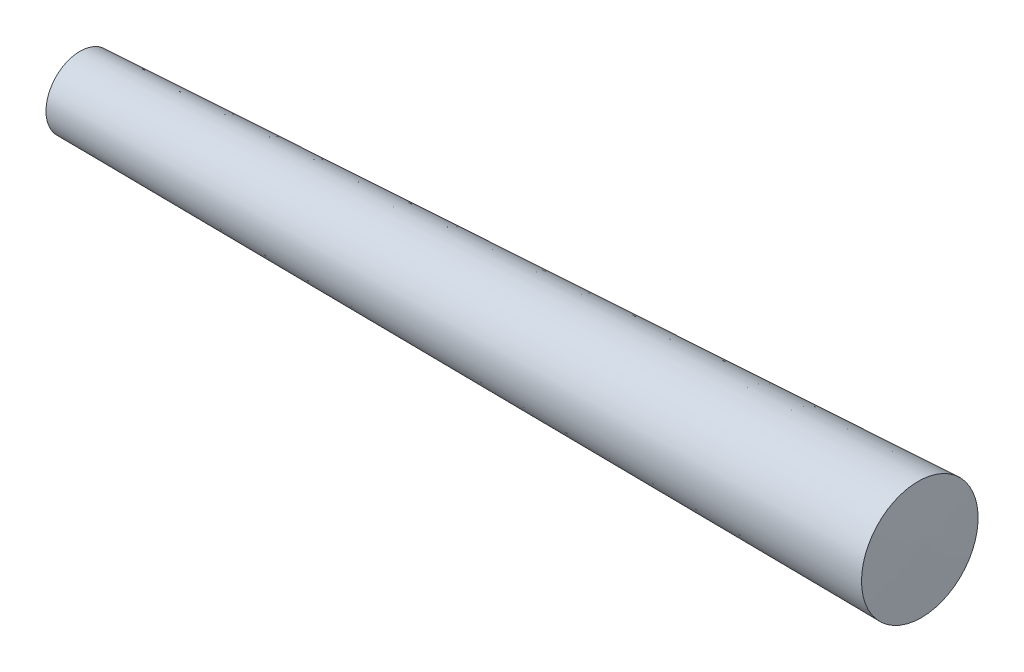
ISO-10303-21;
HEADER;
FILE_DESCRIPTION(('STEP AP214'),'2;1');
FILE_NAME('part.step','',(''),(''),'','','');
FILE_SCHEMA(('AUTOMOTIVE_DESIGN { 1 0 10303 214 1 1 1 1 }'));
ENDSEC;
DATA;
#1=APPLICATION_CONTEXT('core data for automotive mechanical design processes');
#2=APPLICATION_PROTOCOL_DEFINITION('international standard','automotive_design',2000,#1);
#3=PRODUCT_CONTEXT('',#1,'mechanical');
#4=PRODUCT('Part','Part','',(#3));
#5=PRODUCT_RELATED_PRODUCT_CATEGORY('part','',(#4));
#6=PRODUCT_DEFINITION_FORMATION('','',#4);
#7=PRODUCT_DEFINITION_CONTEXT('part definition',#1,'design');
#8=PRODUCT_DEFINITION('design','',#6,#7);
#9=PRODUCT_DEFINITION_SHAPE('','',#8);
#10=(LENGTH_UNIT() NAMED_UNIT(*) SI_UNIT(.MILLI.,.METRE.));
#11=(NAMED_UNIT(*) PLANE_ANGLE_UNIT() SI_UNIT($,.RADIAN.));
#12=(NAMED_UNIT(*) SI_UNIT($,.STERADIAN.) SOLID_ANGLE_UNIT());
#13=UNCERTAINTY_MEASURE_WITH_UNIT(LENGTH_MEASURE(1.E-05),#10,'distance_accuracy_value','');
#14=(GEOMETRIC_REPRESENTATION_CONTEXT(3) GLOBAL_UNCERTAINTY_ASSIGNED_CONTEXT((#13)) GLOBAL_UNIT_ASSIGNED_CONTEXT((#10,
#11,#12)) REPRESENTATION_CONTEXT('',''));
#15=CARTESIAN_POINT('',(0.,0.,0.));
#16=DIRECTION('',(0.,0.,1.));
#17=DIRECTION('',(1.,0.,0.));
#18=AXIS2_PLACEMENT_3D('',#15,#16,#17);
#19=CARTESIAN_POINT('',(0.,1.5,0.));
#20=DIRECTION('',(-0.999614420652718,-0.0277670672403535,0.));
#21=DIRECTION('',(0.0277670672403519,-0.999614420652707,0.));
#22=AXIS2_PLACEMENT_3D('',#19,#20,#21);
#23=CONICAL_SURFACE('',#22,0.,1.54302569020148);
#24=CARTESIAN_POINT('',(-0.0416345412490582,1.49884348496529,0.));
#25=DIRECTION('',(-0.999614420652718,-0.0277670672403535,0.));
#26=DIRECTION('',(0.0277670672403519,-0.999614420652707,0.));
#27=AXIS2_PLACEMENT_3D('',#24,#25,#26);
#28=CIRCLE('',#27,1.49942163097908);
#29=CARTESIAN_POINT('',(0.,0.,0.));
#30=VERTEX_POINT('',#29);
#31=EDGE_CURVE('E49',#30,#30,#28,.T.);
#32=ORIENTED_EDGE('',*,*,#31,.T.);
#33=EDGE_LOOP('',(#32));
#34=FACE_BOUND('',#33,.T.);
#35=CARTESIAN_POINT('',(0.,1.5,0.));
#36=VERTEX_POINT('',#35);
#37=VERTEX_LOOP('',#36);
#38=FACE_BOUND('',#37,.T.);
#39=ADVANCED_FACE('F41',(#34,#38),#23,.F.);
#40=CARTESIAN_POINT('',(35.9306090979182,2.49807247494219,0.));
#41=DIRECTION('',(-0.999614420652718,-0.0277670672403535,0.));
#42=DIRECTION('',(0.0277670672403519,-0.999614420652707,0.));
#43=AXIS2_PLACEMENT_3D('',#40,#41,#42);
#44=CONICAL_SURFACE('',#43,2.4990360516318,1.54302569020148);
#45=CARTESIAN_POINT('',(36.,2.50000000000003,0.));
#46=VERTEX_POINT('',#45);
#47=VERTEX_LOOP('',#46);
#48=FACE_BOUND('',#47,.T.);
#49=CARTESIAN_POINT('',(35.9306090979182,2.49807247494219,0.));
#50=DIRECTION('',(-0.999614420652718,-0.0277670672403535,0.));
#51=DIRECTION('',(0.0277670672403519,-0.999614420652707,0.));
#52=AXIS2_PLACEMENT_3D('',#49,#50,#51);
#53=CIRCLE('',#52,2.4990360516318);
#54=CARTESIAN_POINT('',(36.,0.,0.));
#55=VERTEX_POINT('',#54);
#56=EDGE_CURVE('E11',#55,#55,#53,.T.);
#57=ORIENTED_EDGE('',*,*,#56,.F.);
#58=EDGE_LOOP('',(#57));
#59=FACE_BOUND('',#58,.T.);
#60=ADVANCED_FACE('F55',(#48,#59),#44,.T.);
#61=CARTESIAN_POINT('',(-0.0416345412490582,1.49884348496529,0.));
#62=DIRECTION('',(0.999614420652718,0.0277670672403535,0.));
#63=DIRECTION('',(-0.0277670672403519,0.999614420652707,0.));
#64=AXIS2_PLACEMENT_3D('',#61,#62,#63);
#65=CONICAL_SURFACE('',#64,1.49942163097908,0.027770636593421);
#66=ORIENTED_EDGE('',*,*,#56,.T.);
#67=EDGE_LOOP('',(#66));
#68=FACE_BOUND('',#67,.T.);
#69=ORIENTED_EDGE('',*,*,#31,.F.);
#70=EDGE_LOOP('',(#69));
#71=FACE_BOUND('',#70,.T.);
#72=ADVANCED_FACE('F58',(#68,#71),#65,.T.);
#73=CLOSED_SHELL('',(#39,#60,#72));
#74=MANIFOLD_SOLID_BREP('B2',#73);
#75=ADVANCED_BREP_SHAPE_REPRESENTATION('',(#18,#74),#14);
#76=SHAPE_DEFINITION_REPRESENTATION(#9,#75);
ENDSEC;
END-ISO-10303-21;
